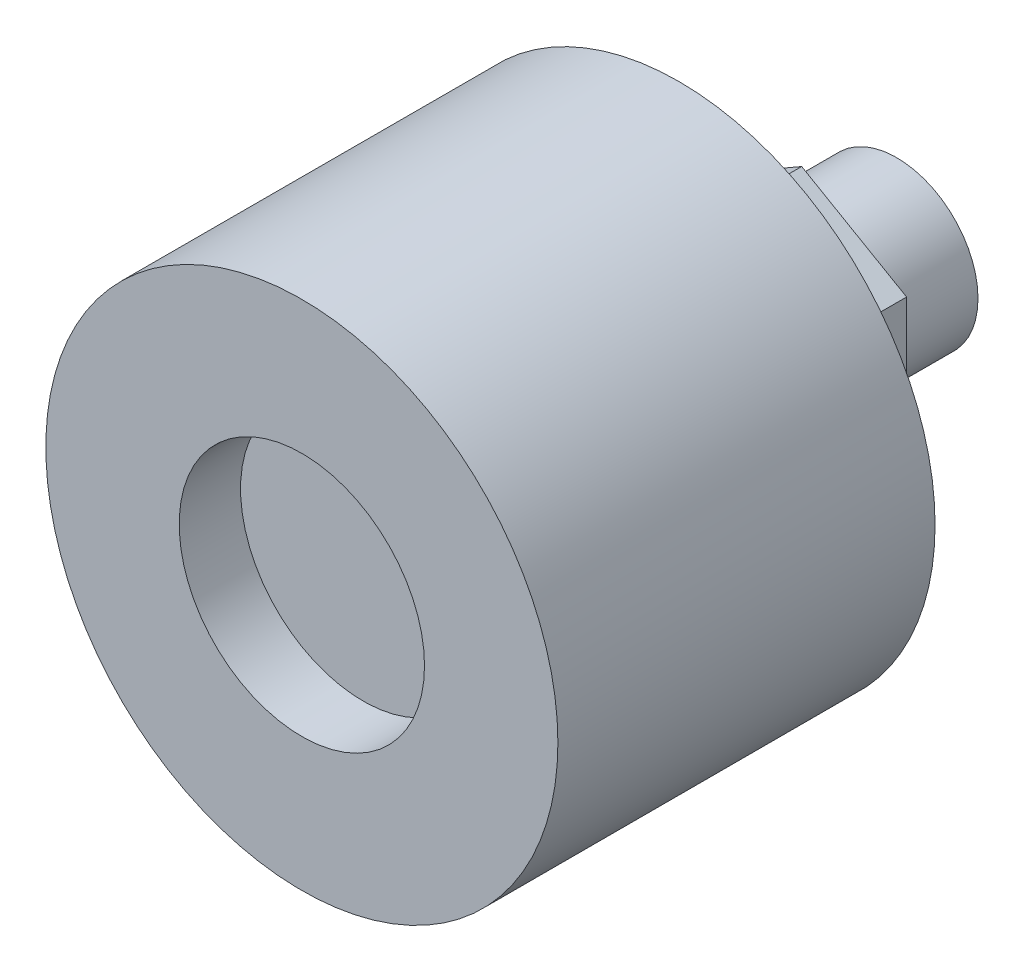
ISO-10303-21;
HEADER;
FILE_DESCRIPTION(('STEP AP214'),'2;1');
FILE_NAME('part.step','',(''),(''),'','','');
FILE_SCHEMA(('AUTOMOTIVE_DESIGN { 1 0 10303 214 1 1 1 1 }'));
ENDSEC;
DATA;
#1=APPLICATION_CONTEXT('core data for automotive mechanical design processes');
#2=APPLICATION_PROTOCOL_DEFINITION('international standard','automotive_design',2000,#1);
#3=PRODUCT_CONTEXT('',#1,'mechanical');
#4=PRODUCT('Part','Part','',(#3));
#5=PRODUCT_RELATED_PRODUCT_CATEGORY('part','',(#4));
#6=PRODUCT_DEFINITION_FORMATION('','',#4);
#7=PRODUCT_DEFINITION_CONTEXT('part definition',#1,'design');
#8=PRODUCT_DEFINITION('design','',#6,#7);
#9=PRODUCT_DEFINITION_SHAPE('','',#8);
#10=(LENGTH_UNIT() NAMED_UNIT(*) SI_UNIT(.MILLI.,.METRE.));
#11=(NAMED_UNIT(*) PLANE_ANGLE_UNIT() SI_UNIT($,.RADIAN.));
#12=(NAMED_UNIT(*) SI_UNIT($,.STERADIAN.) SOLID_ANGLE_UNIT());
#13=UNCERTAINTY_MEASURE_WITH_UNIT(LENGTH_MEASURE(1.E-05),#10,'distance_accuracy_value','');
#14=(GEOMETRIC_REPRESENTATION_CONTEXT(3) GLOBAL_UNCERTAINTY_ASSIGNED_CONTEXT((#13)) GLOBAL_UNIT_ASSIGNED_CONTEXT((#10,
#11,#12)) REPRESENTATION_CONTEXT('',''));
#15=CARTESIAN_POINT('',(0.,0.,0.));
#16=DIRECTION('',(0.,0.,1.));
#17=DIRECTION('',(1.,0.,0.));
#18=AXIS2_PLACEMENT_3D('',#15,#16,#17);
#19=CARTESIAN_POINT('',(0.,0.,-1.));
#20=DIRECTION('',(0.,0.,1.));
#21=DIRECTION('',(1.,0.,0.));
#22=AXIS2_PLACEMENT_3D('',#19,#20,#21);
#23=CYLINDRICAL_SURFACE('',#22,8.35);
#24=CARTESIAN_POINT('',(0.,0.,1.));
#25=DIRECTION('',(0.,0.,1.));
#26=DIRECTION('',(1.,0.,0.));
#27=AXIS2_PLACEMENT_3D('',#24,#25,#26);
#28=CIRCLE('',#27,8.35);
#29=CARTESIAN_POINT('',(8.35,0.,1.));
#30=VERTEX_POINT('',#29);
#31=EDGE_CURVE('E129',#30,#30,#28,.T.);
#32=ORIENTED_EDGE('',*,*,#31,.F.);
#33=EDGE_LOOP('',(#32));
#34=FACE_BOUND('',#33,.T.);
#35=CARTESIAN_POINT('',(0.,0.,-11.3));
#36=DIRECTION('',(0.,0.,-1.));
#37=DIRECTION('',(-1.,0.,0.));
#38=AXIS2_PLACEMENT_3D('',#35,#36,#37);
#39=CIRCLE('',#38,8.35);
#40=CARTESIAN_POINT('',(-8.35,0.,-11.3));
#41=VERTEX_POINT('',#40);
#42=EDGE_CURVE('E116',#41,#41,#39,.T.);
#43=ORIENTED_EDGE('',*,*,#42,.F.);
#44=EDGE_LOOP('',(#43));
#45=FACE_BOUND('',#44,.T.);
#46=ADVANCED_FACE('F39',(#34,#45),#23,.T.);
#47=CARTESIAN_POINT('',(0.,0.,-1.));
#48=DIRECTION('',(0.,0.,1.));
#49=DIRECTION('',(1.,0.,0.));
#50=AXIS2_PLACEMENT_3D('',#47,#48,#49);
#51=CYLINDRICAL_SURFACE('',#50,4.);
#52=CARTESIAN_POINT('',(0.,0.,-1.));
#53=DIRECTION('',(0.,0.,1.));
#54=DIRECTION('',(1.,0.,0.));
#55=AXIS2_PLACEMENT_3D('',#52,#53,#54);
#56=CIRCLE('',#55,4.);
#57=CARTESIAN_POINT('',(4.,0.,-1.));
#58=VERTEX_POINT('',#57);
#59=EDGE_CURVE('E42',#58,#58,#56,.T.);
#60=ORIENTED_EDGE('',*,*,#59,.F.);
#61=EDGE_LOOP('',(#60));
#62=FACE_BOUND('',#61,.T.);
#63=CARTESIAN_POINT('',(0.,0.,1.));
#64=DIRECTION('',(0.,0.,1.));
#65=DIRECTION('',(1.,0.,0.));
#66=AXIS2_PLACEMENT_3D('',#63,#64,#65);
#67=CIRCLE('',#66,4.);
#68=CARTESIAN_POINT('',(4.,0.,1.));
#69=VERTEX_POINT('',#68);
#70=EDGE_CURVE('E121',#69,#69,#67,.T.);
#71=ORIENTED_EDGE('',*,*,#70,.T.);
#72=EDGE_LOOP('',(#71));
#73=FACE_BOUND('',#72,.T.);
#74=ADVANCED_FACE('F140',(#62,#73),#51,.F.);
#75=CARTESIAN_POINT('',(0.,0.,1.));
#76=DIRECTION('',(0.,0.,1.));
#77=DIRECTION('',(1.,0.,0.));
#78=AXIS2_PLACEMENT_3D('',#75,#76,#77);
#79=PLANE('',#78);
#80=ORIENTED_EDGE('',*,*,#31,.T.);
#81=EDGE_LOOP('',(#80));
#82=FACE_BOUND('',#81,.T.);
#83=ORIENTED_EDGE('',*,*,#70,.F.);
#84=EDGE_LOOP('',(#83));
#85=FACE_BOUND('',#84,.T.);
#86=ADVANCED_FACE('F143',(#82,#85),#79,.T.);
#87=CARTESIAN_POINT('',(0.,0.,-1.));
#88=DIRECTION('',(0.,0.,-1.));
#89=DIRECTION('',(-1.,0.,0.));
#90=AXIS2_PLACEMENT_3D('',#87,#88,#89);
#91=PLANE('',#90);
#92=ORIENTED_EDGE('',*,*,#59,.T.);
#93=EDGE_LOOP('',(#92));
#94=FACE_BOUND('',#93,.T.);
#95=ADVANCED_FACE('F138',(#94),#91,.F.);
#96=CARTESIAN_POINT('',(0.,0.,-11.3));
#97=DIRECTION('',(0.,0.,-1.));
#98=DIRECTION('',(-1.,0.,0.));
#99=AXIS2_PLACEMENT_3D('',#96,#97,#98);
#100=PLANE('',#99);
#101=DIRECTION('',(0.866025403784442,0.499999999999995,0.));
#102=VECTOR('',#101,1.);
#103=CARTESIAN_POINT('',(-3.42080034494851,1.97500000000004,-11.3));
#104=LINE('',#103,#102);
#105=CARTESIAN_POINT('',(-3.42080034494851,1.97500000000004,-11.3));
#106=VERTEX_POINT('',#105);
#107=CARTESIAN_POINT('',(0.,3.95,-11.3));
#108=VERTEX_POINT('',#107);
#109=EDGE_CURVE('E55',#106,#108,#104,.T.);
#110=ORIENTED_EDGE('',*,*,#109,.F.);
#111=DIRECTION('',(0.,1.,0.));
#112=VECTOR('',#111,1.);
#113=CARTESIAN_POINT('',(-3.42080034494855,-1.97499999999997,-11.3));
#114=LINE('',#113,#112);
#115=CARTESIAN_POINT('',(-3.42080034494855,-1.97499999999997,-11.3));
#116=VERTEX_POINT('',#115);
#117=EDGE_CURVE('E59',#116,#106,#114,.T.);
#118=ORIENTED_EDGE('',*,*,#117,.F.);
#119=DIRECTION('',(-0.866025403784436,0.500000000000004,0.));
#120=VECTOR('',#119,1.);
#121=CARTESIAN_POINT('',(0.,-3.95,-11.3));
#122=LINE('',#121,#120);
#123=CARTESIAN_POINT('',(0.,-3.95,-11.3));
#124=VERTEX_POINT('',#123);
#125=EDGE_CURVE('E243',#124,#116,#122,.T.);
#126=ORIENTED_EDGE('',*,*,#125,.F.);
#127=DIRECTION('',(-0.86602540378444,-0.499999999999998,0.));
#128=VECTOR('',#127,1.);
#129=CARTESIAN_POINT('',(3.42080034494852,-1.97500000000002,-11.3));
#130=LINE('',#129,#128);
#131=CARTESIAN_POINT('',(3.42080034494852,-1.97500000000002,-11.3));
#132=VERTEX_POINT('',#131);
#133=EDGE_CURVE('E239',#132,#124,#130,.T.);
#134=ORIENTED_EDGE('',*,*,#133,.F.);
#135=DIRECTION('',(0.,-1.,0.));
#136=VECTOR('',#135,1.);
#137=CARTESIAN_POINT('',(3.42080034494854,1.97499999999999,-11.3));
#138=LINE('',#137,#136);
#139=CARTESIAN_POINT('',(3.42080034494854,1.97499999999999,-11.3));
#140=VERTEX_POINT('',#139);
#141=EDGE_CURVE('E235',#140,#132,#138,.T.);
#142=ORIENTED_EDGE('',*,*,#141,.F.);
#143=DIRECTION('',(0.866025403784438,-0.500000000000001,0.));
#144=VECTOR('',#143,1.);
#145=CARTESIAN_POINT('',(0.,3.95,-11.3));
#146=LINE('',#145,#144);
#147=EDGE_CURVE('E232',#108,#140,#146,.T.);
#148=ORIENTED_EDGE('',*,*,#147,.F.);
#149=EDGE_LOOP('',(#110,#118,#126,#134,#142,#148));
#150=FACE_BOUND('',#149,.T.);
#151=ORIENTED_EDGE('',*,*,#42,.T.);
#152=EDGE_LOOP('',(#151));
#153=FACE_BOUND('',#152,.T.);
#154=ADVANCED_FACE('F151',(#150,#153),#100,.T.);
#155=CARTESIAN_POINT('',(-3.42080034494851,1.97500000000004,-15.3));
#156=DIRECTION('',(0.499999999999995,-0.866025403784442,0.));
#157=DIRECTION('',(0.866025403784442,0.499999999999995,0.));
#158=AXIS2_PLACEMENT_3D('',#155,#156,#157);
#159=PLANE('',#158);
#160=ORIENTED_EDGE('',*,*,#109,.T.);
#161=DIRECTION('',(0.,0.,1.));
#162=VECTOR('',#161,1.);
#163=CARTESIAN_POINT('',(0.,3.95,-15.3));
#164=LINE('',#163,#162);
#165=CARTESIAN_POINT('',(0.,3.95,-15.3));
#166=VERTEX_POINT('',#165);
#167=EDGE_CURVE('E96',#166,#108,#164,.T.);
#168=ORIENTED_EDGE('',*,*,#167,.F.);
#169=DIRECTION('',(0.866025403784442,0.499999999999995,0.));
#170=VECTOR('',#169,1.);
#171=CARTESIAN_POINT('',(-3.42080034494851,1.97500000000004,-15.3));
#172=LINE('',#171,#170);
#173=CARTESIAN_POINT('',(-3.42080034494851,1.97500000000004,-15.3));
#174=VERTEX_POINT('',#173);
#175=EDGE_CURVE('E103',#174,#166,#172,.T.);
#176=ORIENTED_EDGE('',*,*,#175,.F.);
#177=DIRECTION('',(0.,0.,1.));
#178=VECTOR('',#177,1.);
#179=CARTESIAN_POINT('',(-3.42080034494851,1.97500000000004,-15.3));
#180=LINE('',#179,#178);
#181=EDGE_CURVE('E229',#174,#106,#180,.T.);
#182=ORIENTED_EDGE('',*,*,#181,.T.);
#183=EDGE_LOOP('',(#160,#168,#176,#182));
#184=FACE_BOUND('',#183,.T.);
#185=ADVANCED_FACE('F114',(#184),#159,.F.);
#186=CARTESIAN_POINT('',(0.,3.95,-15.3));
#187=DIRECTION('',(-0.500000000000001,-0.866025403784438,0.));
#188=DIRECTION('',(0.866025403784438,-0.500000000000001,0.));
#189=AXIS2_PLACEMENT_3D('',#186,#187,#188);
#190=PLANE('',#189);
#191=ORIENTED_EDGE('',*,*,#147,.T.);
#192=DIRECTION('',(0.,0.,1.));
#193=VECTOR('',#192,1.);
#194=CARTESIAN_POINT('',(3.42080034494854,1.97499999999999,-15.3));
#195=LINE('',#194,#193);
#196=CARTESIAN_POINT('',(3.42080034494854,1.97499999999999,-15.3));
#197=VERTEX_POINT('',#196);
#198=EDGE_CURVE('E98',#197,#140,#195,.T.);
#199=ORIENTED_EDGE('',*,*,#198,.F.);
#200=DIRECTION('',(0.866025403784438,-0.500000000000001,0.));
#201=VECTOR('',#200,1.);
#202=CARTESIAN_POINT('',(0.,3.95,-15.3));
#203=LINE('',#202,#201);
#204=EDGE_CURVE('E91',#166,#197,#203,.T.);
#205=ORIENTED_EDGE('',*,*,#204,.F.);
#206=ORIENTED_EDGE('',*,*,#167,.T.);
#207=EDGE_LOOP('',(#191,#199,#205,#206));
#208=FACE_BOUND('',#207,.T.);
#209=ADVANCED_FACE('F94',(#208),#190,.F.);
#210=CARTESIAN_POINT('',(3.42080034494854,1.97499999999999,-15.3));
#211=DIRECTION('',(-1.,0.,0.));
#212=DIRECTION('',(0.,-1.,0.));
#213=AXIS2_PLACEMENT_3D('',#210,#211,#212);
#214=PLANE('',#213);
#215=ORIENTED_EDGE('',*,*,#141,.T.);
#216=DIRECTION('',(0.,0.,1.));
#217=VECTOR('',#216,1.);
#218=CARTESIAN_POINT('',(3.42080034494852,-1.97500000000002,-15.3));
#219=LINE('',#218,#217);
#220=CARTESIAN_POINT('',(3.42080034494852,-1.97500000000002,-15.3));
#221=VERTEX_POINT('',#220);
#222=EDGE_CURVE('E123',#221,#132,#219,.T.);
#223=ORIENTED_EDGE('',*,*,#222,.F.);
#224=DIRECTION('',(0.,-1.,0.));
#225=VECTOR('',#224,1.);
#226=CARTESIAN_POINT('',(3.42080034494854,1.97499999999999,-15.3));
#227=LINE('',#226,#225);
#228=EDGE_CURVE('E102',#197,#221,#227,.T.);
#229=ORIENTED_EDGE('',*,*,#228,.F.);
#230=ORIENTED_EDGE('',*,*,#198,.T.);
#231=EDGE_LOOP('',(#215,#223,#229,#230));
#232=FACE_BOUND('',#231,.T.);
#233=ADVANCED_FACE('F169',(#232),#214,.F.);
#234=CARTESIAN_POINT('',(3.42080034494852,-1.97500000000002,-15.3));
#235=DIRECTION('',(-0.499999999999998,0.86602540378444,0.));
#236=DIRECTION('',(-0.86602540378444,-0.499999999999998,0.));
#237=AXIS2_PLACEMENT_3D('',#234,#235,#236);
#238=PLANE('',#237);
#239=ORIENTED_EDGE('',*,*,#133,.T.);
#240=DIRECTION('',(0.,0.,1.));
#241=VECTOR('',#240,1.);
#242=CARTESIAN_POINT('',(0.,-3.95,-15.3));
#243=LINE('',#242,#241);
#244=CARTESIAN_POINT('',(0.,-3.95,-15.3));
#245=VERTEX_POINT('',#244);
#246=EDGE_CURVE('E254',#245,#124,#243,.T.);
#247=ORIENTED_EDGE('',*,*,#246,.F.);
#248=DIRECTION('',(-0.86602540378444,-0.499999999999998,0.));
#249=VECTOR('',#248,1.);
#250=CARTESIAN_POINT('',(3.42080034494852,-1.97500000000002,-15.3));
#251=LINE('',#250,#249);
#252=EDGE_CURVE('E221',#221,#245,#251,.T.);
#253=ORIENTED_EDGE('',*,*,#252,.F.);
#254=ORIENTED_EDGE('',*,*,#222,.T.);
#255=EDGE_LOOP('',(#239,#247,#253,#254));
#256=FACE_BOUND('',#255,.T.);
#257=ADVANCED_FACE('F172',(#256),#238,.F.);
#258=CARTESIAN_POINT('',(0.,-3.95,-15.3));
#259=DIRECTION('',(0.500000000000004,0.866025403784436,0.));
#260=DIRECTION('',(-0.866025403784436,0.500000000000004,0.));
#261=AXIS2_PLACEMENT_3D('',#258,#259,#260);
#262=PLANE('',#261);
#263=ORIENTED_EDGE('',*,*,#125,.T.);
#264=DIRECTION('',(0.,0.,1.));
#265=VECTOR('',#264,1.);
#266=CARTESIAN_POINT('',(-3.42080034494855,-1.97499999999997,-15.3));
#267=LINE('',#266,#265);
#268=CARTESIAN_POINT('',(-3.42080034494855,-1.97499999999997,-15.3));
#269=VERTEX_POINT('',#268);
#270=EDGE_CURVE('E250',#269,#116,#267,.T.);
#271=ORIENTED_EDGE('',*,*,#270,.F.);
#272=DIRECTION('',(-0.866025403784436,0.500000000000004,0.));
#273=VECTOR('',#272,1.);
#274=CARTESIAN_POINT('',(0.,-3.95,-15.3));
#275=LINE('',#274,#273);
#276=EDGE_CURVE('E224',#245,#269,#275,.T.);
#277=ORIENTED_EDGE('',*,*,#276,.F.);
#278=ORIENTED_EDGE('',*,*,#246,.T.);
#279=EDGE_LOOP('',(#263,#271,#277,#278));
#280=FACE_BOUND('',#279,.T.);
#281=ADVANCED_FACE('F176',(#280),#262,.F.);
#282=CARTESIAN_POINT('',(-3.42080034494855,-1.97499999999997,-15.3));
#283=DIRECTION('',(1.,0.,0.));
#284=DIRECTION('',(0.,1.,0.));
#285=AXIS2_PLACEMENT_3D('',#282,#283,#284);
#286=PLANE('',#285);
#287=ORIENTED_EDGE('',*,*,#117,.T.);
#288=ORIENTED_EDGE('',*,*,#181,.F.);
#289=DIRECTION('',(0.,1.,0.));
#290=VECTOR('',#289,1.);
#291=CARTESIAN_POINT('',(-3.42080034494855,-1.97499999999997,-15.3));
#292=LINE('',#291,#290);
#293=EDGE_CURVE('E108',#269,#174,#292,.T.);
#294=ORIENTED_EDGE('',*,*,#293,.F.);
#295=ORIENTED_EDGE('',*,*,#270,.T.);
#296=EDGE_LOOP('',(#287,#288,#294,#295));
#297=FACE_BOUND('',#296,.T.);
#298=ADVANCED_FACE('F180',(#297),#286,.F.);
#299=CARTESIAN_POINT('',(0.,0.,-15.3));
#300=DIRECTION('',(0.,0.,-1.));
#301=DIRECTION('',(-1.,0.,0.));
#302=AXIS2_PLACEMENT_3D('',#299,#300,#301);
#303=PLANE('',#302);
#304=CARTESIAN_POINT('',(0.,0.,-15.3));
#305=DIRECTION('',(0.,0.,-1.));
#306=DIRECTION('',(-1.,0.,0.));
#307=AXIS2_PLACEMENT_3D('',#304,#305,#306);
#308=CIRCLE('',#307,2.65);
#309=CARTESIAN_POINT('',(2.65,0.,-15.3));
#310=VERTEX_POINT('',#309);
#311=EDGE_CURVE('E11',#310,#310,#308,.T.);
#312=ORIENTED_EDGE('',*,*,#311,.F.);
#313=EDGE_LOOP('',(#312));
#314=FACE_BOUND('',#313,.T.);
#315=ORIENTED_EDGE('',*,*,#175,.T.);
#316=ORIENTED_EDGE('',*,*,#204,.T.);
#317=ORIENTED_EDGE('',*,*,#228,.T.);
#318=ORIENTED_EDGE('',*,*,#252,.T.);
#319=ORIENTED_EDGE('',*,*,#276,.T.);
#320=ORIENTED_EDGE('',*,*,#293,.T.);
#321=EDGE_LOOP('',(#315,#316,#317,#318,#319,#320));
#322=FACE_BOUND('',#321,.T.);
#323=ADVANCED_FACE('F106',(#314,#322),#303,.T.);
#324=CARTESIAN_POINT('',(0.,0.,-18.4));
#325=DIRECTION('',(0.,0.,1.));
#326=DIRECTION('',(1.,0.,0.));
#327=AXIS2_PLACEMENT_3D('',#324,#325,#326);
#328=CYLINDRICAL_SURFACE('',#327,2.65);
#329=CARTESIAN_POINT('',(0.,0.,-18.4));
#330=DIRECTION('',(0.,0.,-1.));
#331=DIRECTION('',(-1.,0.,0.));
#332=AXIS2_PLACEMENT_3D('',#329,#330,#331);
#333=CIRCLE('',#332,2.65);
#334=CARTESIAN_POINT('',(2.65,0.,-18.4));
#335=VERTEX_POINT('',#334);
#336=EDGE_CURVE('E209',#335,#335,#333,.T.);
#337=CARTESIAN_POINT('',(2.65,0.,-18.4));
#338=CARTESIAN_POINT('',(2.65,0.,-18.3677083333333));
#339=CARTESIAN_POINT('',(2.65,0.,-18.3354166666667));
#340=CARTESIAN_POINT('',(2.65,0.,-18.2708333333333));
#341=CARTESIAN_POINT('',(2.65,0.,-18.2385416666667));
#342=CARTESIAN_POINT('',(2.65,0.,-18.1739583333333));
#343=CARTESIAN_POINT('',(2.65,0.,-18.1416666666667));
#344=CARTESIAN_POINT('',(2.65,0.,-18.0770833333333));
#345=CARTESIAN_POINT('',(2.65,0.,-18.0447916666667));
#346=CARTESIAN_POINT('',(2.65,0.,-17.9802083333333));
#347=CARTESIAN_POINT('',(2.65,0.,-17.9479166666667));
#348=CARTESIAN_POINT('',(2.65,0.,-17.8833333333333));
#349=CARTESIAN_POINT('',(2.65,0.,-17.8510416666667));
#350=CARTESIAN_POINT('',(2.65,0.,-17.7864583333333));
#351=CARTESIAN_POINT('',(2.65,0.,-17.7541666666667));
#352=CARTESIAN_POINT('',(2.65,0.,-17.6895833333333));
#353=CARTESIAN_POINT('',(2.65,0.,-17.6572916666667));
#354=CARTESIAN_POINT('',(2.65,0.,-17.5927083333333));
#355=CARTESIAN_POINT('',(2.65,0.,-17.5604166666667));
#356=CARTESIAN_POINT('',(2.65,0.,-17.4958333333333));
#357=CARTESIAN_POINT('',(2.65,0.,-17.4635416666667));
#358=CARTESIAN_POINT('',(2.65,0.,-17.3989583333333));
#359=CARTESIAN_POINT('',(2.65,0.,-17.3666666666667));
#360=CARTESIAN_POINT('',(2.65,0.,-17.3020833333333));
#361=CARTESIAN_POINT('',(2.65,0.,-17.2697916666667));
#362=CARTESIAN_POINT('',(2.65,0.,-17.2052083333333));
#363=CARTESIAN_POINT('',(2.65,0.,-17.1729166666667));
#364=CARTESIAN_POINT('',(2.65,0.,-17.1083333333333));
#365=CARTESIAN_POINT('',(2.65,0.,-17.0760416666667));
#366=CARTESIAN_POINT('',(2.65,0.,-17.0114583333333));
#367=CARTESIAN_POINT('',(2.65,0.,-16.9791666666667));
#368=CARTESIAN_POINT('',(2.65,0.,-16.9145833333333));
#369=CARTESIAN_POINT('',(2.65,0.,-16.8822916666667));
#370=CARTESIAN_POINT('',(2.65,0.,-16.8177083333333));
#371=CARTESIAN_POINT('',(2.65,0.,-16.7854166666667));
#372=CARTESIAN_POINT('',(2.65,0.,-16.7208333333333));
#373=CARTESIAN_POINT('',(2.65,0.,-16.6885416666667));
#374=CARTESIAN_POINT('',(2.65,0.,-16.6239583333333));
#375=CARTESIAN_POINT('',(2.65,0.,-16.5916666666667));
#376=CARTESIAN_POINT('',(2.65,0.,-16.5270833333333));
#377=CARTESIAN_POINT('',(2.65,0.,-16.4947916666667));
#378=CARTESIAN_POINT('',(2.65,0.,-16.4302083333333));
#379=CARTESIAN_POINT('',(2.65,0.,-16.3979166666667));
#380=CARTESIAN_POINT('',(2.65,0.,-16.3333333333333));
#381=CARTESIAN_POINT('',(2.65,0.,-16.3010416666667));
#382=CARTESIAN_POINT('',(2.65,0.,-16.2364583333333));
#383=CARTESIAN_POINT('',(2.65,0.,-16.2041666666667));
#384=CARTESIAN_POINT('',(2.65,0.,-16.1395833333333));
#385=CARTESIAN_POINT('',(2.65,0.,-16.1072916666667));
#386=CARTESIAN_POINT('',(2.65,0.,-16.0427083333333));
#387=CARTESIAN_POINT('',(2.65,0.,-16.0104166666667));
#388=CARTESIAN_POINT('',(2.65,0.,-15.9458333333333));
#389=CARTESIAN_POINT('',(2.65,0.,-15.9135416666667));
#390=CARTESIAN_POINT('',(2.65,0.,-15.8489583333333));
#391=CARTESIAN_POINT('',(2.65,0.,-15.8166666666667));
#392=CARTESIAN_POINT('',(2.65,0.,-15.7520833333333));
#393=CARTESIAN_POINT('',(2.65,0.,-15.7197916666667));
#394=CARTESIAN_POINT('',(2.65,0.,-15.6552083333333));
#395=CARTESIAN_POINT('',(2.65,0.,-15.6229166666667));
#396=CARTESIAN_POINT('',(2.65,0.,-15.5583333333333));
#397=CARTESIAN_POINT('',(2.65,0.,-15.5260416666667));
#398=CARTESIAN_POINT('',(2.65,0.,-15.4614583333333));
#399=CARTESIAN_POINT('',(2.65,0.,-15.4291666666667));
#400=CARTESIAN_POINT('',(2.65,0.,-15.3645833333333));
#401=CARTESIAN_POINT('',(2.65,0.,-15.3322916666667));
#402=CARTESIAN_POINT('',(2.65,0.,-15.3));
#403=B_SPLINE_CURVE_WITH_KNOTS('',3,(#337,#338,#339,#340,#341,#342,#343,#344,#345,#346,#347,
#348,#349,#350,#351,#352,#353,#354,#355,#356,#357,#358,#359,#360,#361,#362,#363,#364,#365,#366,
#367,#368,#369,#370,#371,#372,#373,#374,#375,#376,#377,#378,#379,#380,#381,#382,#383,#384,#385,
#386,#387,#388,#389,#390,#391,#392,#393,#394,#395,#396,#397,#398,#399,#400,#401,#402),
.UNSPECIFIED.,.F.,.F.,(4,2,2,2,2,2,2,2,2,2,2,2,2,2,2,2,2,2,2,2,2,2,2,2,2,2,2,2,2,2,2,2,4),(0.,
0.0968749999999997,0.193749999999999,0.290624999999999,0.387499999999999,0.484374999999999,
0.581249999999998,0.678124999999998,0.774999999999998,0.871874999999998,0.968749999999997,
1.065625,1.1625,1.259375,1.35625,1.453125,1.55,1.646875,1.74375,1.840625,1.9375,2.034375,
2.13125,2.228125,2.325,2.421875,2.51875,2.615625,2.7125,2.809375,2.90625,3.003125,3.1),.UNSPECIFIED.);
#404=EDGE_CURVE('BSEAM187',#335,#310,#403,.T.);
#405=ORIENTED_EDGE('',*,*,#336,.F.);
#406=ORIENTED_EDGE('',*,*,#311,.T.);
#407=ORIENTED_EDGE('',*,*,#404,.T.);
#408=ORIENTED_EDGE('',*,*,#404,.F.);
#409=EDGE_LOOP('',(#405,#407,#406,#408));
#410=FACE_BOUND('',#409,.T.);
#411=ADVANCED_FACE('F187',(#410),#328,.T.);
#412=CARTESIAN_POINT('',(0.,0.,-18.4));
#413=DIRECTION('',(0.,0.,-1.));
#414=DIRECTION('',(-1.,0.,0.));
#415=AXIS2_PLACEMENT_3D('',#412,#413,#414);
#416=PLANE('',#415);
#417=CARTESIAN_POINT('',(0.,0.,-18.4));
#418=DIRECTION('',(0.,0.,-1.));
#419=DIRECTION('',(-1.,0.,0.));
#420=AXIS2_PLACEMENT_3D('',#417,#418,#419);
#421=CIRCLE('',#420,0.244312337230213);
#422=CARTESIAN_POINT('',(-0.244312337230213,0.,-18.4));
#423=VERTEX_POINT('',#422);
#424=EDGE_CURVE('E210',#423,#423,#421,.T.);
#425=ORIENTED_EDGE('',*,*,#424,.F.);
#426=EDGE_LOOP('',(#425));
#427=FACE_BOUND('',#426,.T.);
#428=ORIENTED_EDGE('',*,*,#336,.T.);
#429=EDGE_LOOP('',(#428));
#430=FACE_BOUND('',#429,.T.);
#431=ADVANCED_FACE('F191',(#427,#430),#416,.T.);
#432=CARTESIAN_POINT('',(0.,0.,-16.4));
#433=DIRECTION('',(0.,0.,-1.));
#434=DIRECTION('',(-1.,0.,0.));
#435=AXIS2_PLACEMENT_3D('',#432,#433,#434);
#436=CYLINDRICAL_SURFACE('',#435,0.244312337230213);
#437=CARTESIAN_POINT('',(0.,0.,-16.4));
#438=DIRECTION('',(0.,0.,-1.));
#439=DIRECTION('',(-1.,0.,0.));
#440=AXIS2_PLACEMENT_3D('',#437,#438,#439);
#441=CIRCLE('',#440,0.244312337230213);
#442=CARTESIAN_POINT('',(-0.244312337230213,0.,-16.4));
#443=VERTEX_POINT('',#442);
#444=EDGE_CURVE('E207',#443,#443,#441,.T.);
#445=ORIENTED_EDGE('',*,*,#444,.F.);
#446=EDGE_LOOP('',(#445));
#447=FACE_BOUND('',#446,.T.);
#448=ORIENTED_EDGE('',*,*,#424,.T.);
#449=EDGE_LOOP('',(#448));
#450=FACE_BOUND('',#449,.T.);
#451=ADVANCED_FACE('F195',(#447,#450),#436,.F.);
#452=CARTESIAN_POINT('',(0.,0.,-16.4));
#453=DIRECTION('',(0.,0.,-1.));
#454=DIRECTION('',(-1.,0.,0.));
#455=AXIS2_PLACEMENT_3D('',#452,#453,#454);
#456=PLANE('',#455);
#457=ORIENTED_EDGE('',*,*,#444,.T.);
#458=EDGE_LOOP('',(#457));
#459=FACE_BOUND('',#458,.T.);
#460=ADVANCED_FACE('F199',(#459),#456,.T.);
#461=CLOSED_SHELL('',(#46,#74,#86,#95,#154,#185,#209,#233,#257,#281,#298,#323,#411,#431,#451,#460));
#462=MANIFOLD_SOLID_BREP('B2',#461);
#463=ADVANCED_BREP_SHAPE_REPRESENTATION('',(#18,#462),#14);
#464=SHAPE_DEFINITION_REPRESENTATION(#9,#463);
ENDSEC;
END-ISO-10303-21;
